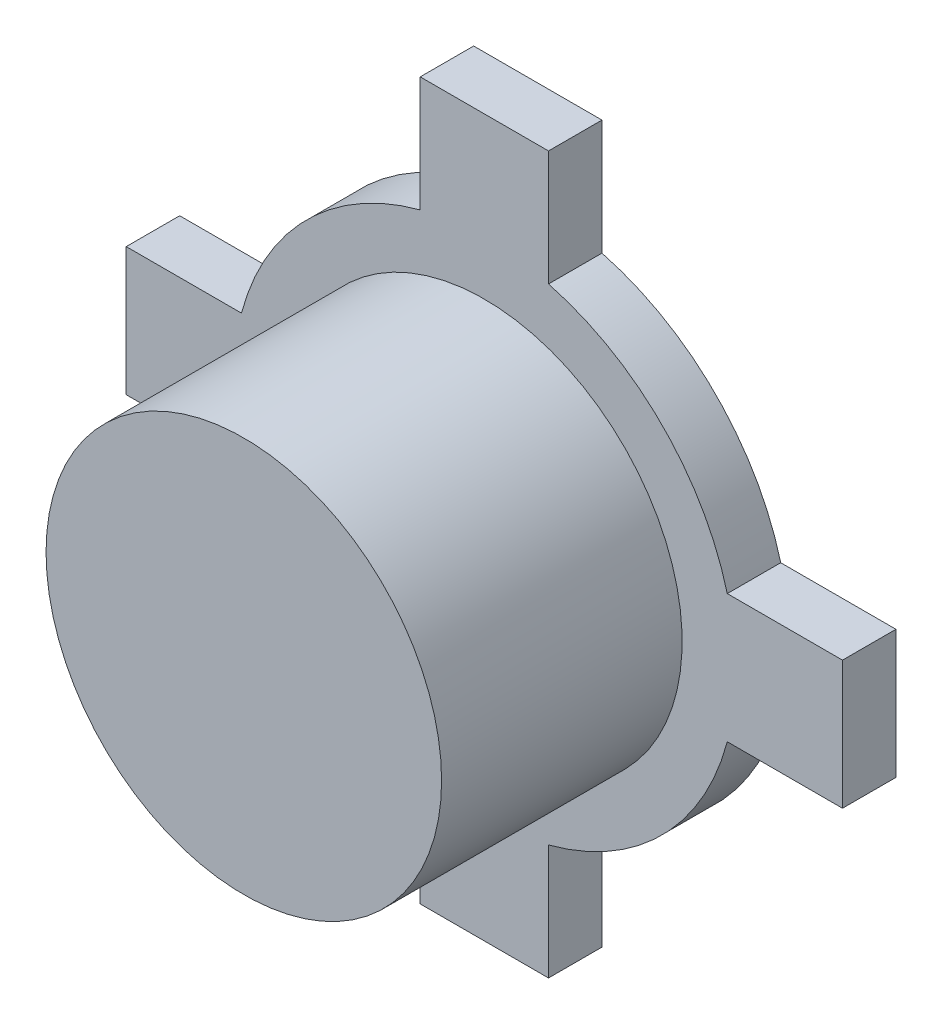
ISO-10303-21;
HEADER;
FILE_DESCRIPTION(('STEP AP214'),'2;1');
FILE_NAME('part.step','',(''),(''),'','','');
FILE_SCHEMA(('AUTOMOTIVE_DESIGN { 1 0 10303 214 1 1 1 1 }'));
ENDSEC;
DATA;
#1=APPLICATION_CONTEXT('core data for automotive mechanical design processes');
#2=APPLICATION_PROTOCOL_DEFINITION('international standard','automotive_design',2000,#1);
#3=PRODUCT_CONTEXT('',#1,'mechanical');
#4=PRODUCT('Part','Part','',(#3));
#5=PRODUCT_RELATED_PRODUCT_CATEGORY('part','',(#4));
#6=PRODUCT_DEFINITION_FORMATION('','',#4);
#7=PRODUCT_DEFINITION_CONTEXT('part definition',#1,'design');
#8=PRODUCT_DEFINITION('design','',#6,#7);
#9=PRODUCT_DEFINITION_SHAPE('','',#8);
#10=(LENGTH_UNIT() NAMED_UNIT(*) SI_UNIT(.MILLI.,.METRE.));
#11=(NAMED_UNIT(*) PLANE_ANGLE_UNIT() SI_UNIT($,.RADIAN.));
#12=(NAMED_UNIT(*) SI_UNIT($,.STERADIAN.) SOLID_ANGLE_UNIT());
#13=UNCERTAINTY_MEASURE_WITH_UNIT(LENGTH_MEASURE(1.E-05),#10,'distance_accuracy_value','');
#14=(GEOMETRIC_REPRESENTATION_CONTEXT(3) GLOBAL_UNCERTAINTY_ASSIGNED_CONTEXT((#13)) GLOBAL_UNIT_ASSIGNED_CONTEXT((#10,
#11,#12)) REPRESENTATION_CONTEXT('',''));
#15=CARTESIAN_POINT('',(0.,0.,0.));
#16=DIRECTION('',(0.,0.,1.));
#17=DIRECTION('',(1.,0.,0.));
#18=AXIS2_PLACEMENT_3D('',#15,#16,#17);
#19=CARTESIAN_POINT('',(0.,0.,4.5));
#20=DIRECTION('',(0.,0.,-1.));
#21=DIRECTION('',(-1.,0.,0.));
#22=AXIS2_PLACEMENT_3D('',#19,#20,#21);
#23=CYLINDRICAL_SURFACE('',#22,3.70000000000001);
#24=CARTESIAN_POINT('',(0.,0.,4.5));
#25=DIRECTION('',(0.,0.,1.));
#26=DIRECTION('',(1.,0.,0.));
#27=AXIS2_PLACEMENT_3D('',#24,#25,#26);
#28=CIRCLE('',#27,3.70000000000001);
#29=CARTESIAN_POINT('',(3.70000000000001,0.,4.5));
#30=VERTEX_POINT('',#29);
#31=EDGE_CURVE('E11',#30,#30,#28,.T.);
#32=ORIENTED_EDGE('',*,*,#31,.F.);
#33=EDGE_LOOP('',(#32));
#34=FACE_BOUND('',#33,.T.);
#35=CARTESIAN_POINT('',(0.,0.,0.));
#36=DIRECTION('',(0.,0.,-1.));
#37=DIRECTION('',(-1.,0.,0.));
#38=AXIS2_PLACEMENT_3D('',#35,#36,#37);
#39=CIRCLE('',#38,3.70000000000001);
#40=CARTESIAN_POINT('',(-3.70000000000001,0.,0.));
#41=VERTEX_POINT('',#40);
#42=EDGE_CURVE('E43',#41,#41,#39,.T.);
#43=ORIENTED_EDGE('',*,*,#42,.F.);
#44=EDGE_LOOP('',(#43));
#45=FACE_BOUND('',#44,.T.);
#46=ADVANCED_FACE('F35',(#34,#45),#23,.T.);
#47=CARTESIAN_POINT('',(0.,0.,4.5));
#48=DIRECTION('',(0.,0.,1.));
#49=DIRECTION('',(1.,0.,0.));
#50=AXIS2_PLACEMENT_3D('',#47,#48,#49);
#51=PLANE('',#50);
#52=ORIENTED_EDGE('',*,*,#31,.T.);
#53=EDGE_LOOP('',(#52));
#54=FACE_BOUND('',#53,.T.);
#55=ADVANCED_FACE('F255',(#54),#51,.T.);
#56=CARTESIAN_POINT('',(-1.2,6.7,-1.));
#57=DIRECTION('',(0.,-1.,0.));
#58=DIRECTION('',(0.,0.,-1.));
#59=AXIS2_PLACEMENT_3D('',#56,#57,#58);
#60=PLANE('',#59);
#61=DIRECTION('',(1.,0.,0.));
#62=VECTOR('',#61,1.);
#63=CARTESIAN_POINT('',(-1.2,6.7,0.));
#64=LINE('',#63,#62);
#65=CARTESIAN_POINT('',(-1.2,6.7,0.));
#66=VERTEX_POINT('',#65);
#67=CARTESIAN_POINT('',(1.2,6.7,0.));
#68=VERTEX_POINT('',#67);
#69=EDGE_CURVE('E180',#66,#68,#64,.T.);
#70=ORIENTED_EDGE('',*,*,#69,.T.);
#71=DIRECTION('',(0.,0.,1.));
#72=VECTOR('',#71,1.);
#73=CARTESIAN_POINT('',(1.2,6.7,-1.));
#74=LINE('',#73,#72);
#75=CARTESIAN_POINT('',(1.2,6.7,-1.));
#76=VERTEX_POINT('',#75);
#77=EDGE_CURVE('E247',#76,#68,#74,.T.);
#78=ORIENTED_EDGE('',*,*,#77,.F.);
#79=DIRECTION('',(1.,0.,0.));
#80=VECTOR('',#79,1.);
#81=CARTESIAN_POINT('',(-1.2,6.7,-1.));
#82=LINE('',#81,#80);
#83=CARTESIAN_POINT('',(-1.2,6.7,-1.));
#84=VERTEX_POINT('',#83);
#85=EDGE_CURVE('E210',#84,#76,#82,.T.);
#86=ORIENTED_EDGE('',*,*,#85,.F.);
#87=DIRECTION('',(0.,0.,1.));
#88=VECTOR('',#87,1.);
#89=CARTESIAN_POINT('',(-1.2,6.7,-1.));
#90=LINE('',#89,#88);
#91=EDGE_CURVE('E176',#84,#66,#90,.T.);
#92=ORIENTED_EDGE('',*,*,#91,.T.);
#93=EDGE_LOOP('',(#70,#78,#86,#92));
#94=FACE_BOUND('',#93,.T.);
#95=ADVANCED_FACE('F260',(#94),#60,.F.);
#96=CARTESIAN_POINT('',(1.2,6.7,-1.));
#97=DIRECTION('',(-1.,0.,0.));
#98=DIRECTION('',(0.,-1.,0.));
#99=AXIS2_PLACEMENT_3D('',#96,#97,#98);
#100=PLANE('',#99);
#101=DIRECTION('',(0.,-1.,0.));
#102=VECTOR('',#101,1.);
#103=CARTESIAN_POINT('',(1.2,6.7,0.));
#104=LINE('',#103,#102);
#105=CARTESIAN_POINT('',(1.2,4.54422710700072,0.));
#106=VERTEX_POINT('',#105);
#107=EDGE_CURVE('E183',#68,#106,#104,.T.);
#108=ORIENTED_EDGE('',*,*,#107,.T.);
#109=DIRECTION('',(0.,0.,1.));
#110=VECTOR('',#109,1.);
#111=CARTESIAN_POINT('',(1.2,4.54422710700072,-1.));
#112=LINE('',#111,#110);
#113=CARTESIAN_POINT('',(1.2,4.54422710700072,-1.));
#114=VERTEX_POINT('',#113);
#115=EDGE_CURVE('E244',#114,#106,#112,.T.);
#116=ORIENTED_EDGE('',*,*,#115,.F.);
#117=DIRECTION('',(0.,-1.,0.));
#118=VECTOR('',#117,1.);
#119=CARTESIAN_POINT('',(1.2,6.7,-1.));
#120=LINE('',#119,#118);
#121=EDGE_CURVE('E119',#76,#114,#120,.T.);
#122=ORIENTED_EDGE('',*,*,#121,.F.);
#123=ORIENTED_EDGE('',*,*,#77,.T.);
#124=EDGE_LOOP('',(#108,#116,#122,#123));
#125=FACE_BOUND('',#124,.T.);
#126=ADVANCED_FACE('F266',(#125),#100,.F.);
#127=CARTESIAN_POINT('',(0.,0.,-1.));
#128=DIRECTION('',(0.,0.,1.));
#129=DIRECTION('',(1.,0.,0.));
#130=AXIS2_PLACEMENT_3D('',#127,#128,#129);
#131=CYLINDRICAL_SURFACE('',#130,4.70000000000001);
#132=CARTESIAN_POINT('',(0.,0.,0.));
#133=DIRECTION('',(0.,0.,-1.));
#134=DIRECTION('',(-1.,0.,0.));
#135=AXIS2_PLACEMENT_3D('',#132,#133,#134);
#136=CIRCLE('',#135,4.70000000000001);
#137=CARTESIAN_POINT('',(4.54422710700072,1.2,0.));
#138=VERTEX_POINT('',#137);
#139=EDGE_CURVE('E185',#106,#138,#136,.T.);
#140=ORIENTED_EDGE('',*,*,#139,.T.);
#141=DIRECTION('',(0.,0.,1.));
#142=VECTOR('',#141,1.);
#143=CARTESIAN_POINT('',(4.54422710700072,1.2,-1.));
#144=LINE('',#143,#142);
#145=CARTESIAN_POINT('',(4.54422710700072,1.2,-1.));
#146=VERTEX_POINT('',#145);
#147=EDGE_CURVE('E241',#146,#138,#144,.T.);
#148=ORIENTED_EDGE('',*,*,#147,.F.);
#149=CARTESIAN_POINT('',(0.,0.,-1.));
#150=DIRECTION('',(0.,0.,-1.));
#151=DIRECTION('',(-1.,0.,0.));
#152=AXIS2_PLACEMENT_3D('',#149,#150,#151);
#153=CIRCLE('',#152,4.70000000000001);
#154=EDGE_CURVE('E450',#114,#146,#153,.T.);
#155=ORIENTED_EDGE('',*,*,#154,.F.);
#156=ORIENTED_EDGE('',*,*,#115,.T.);
#157=EDGE_LOOP('',(#140,#148,#155,#156));
#158=FACE_BOUND('',#157,.T.);
#159=ADVANCED_FACE('F272',(#158),#131,.T.);
#160=CARTESIAN_POINT('',(4.54422710700072,1.2,-1.));
#161=DIRECTION('',(0.,-1.,0.));
#162=DIRECTION('',(0.,0.,-1.));
#163=AXIS2_PLACEMENT_3D('',#160,#161,#162);
#164=PLANE('',#163);
#165=DIRECTION('',(1.,0.,0.));
#166=VECTOR('',#165,1.);
#167=CARTESIAN_POINT('',(4.54422710700072,1.2,0.));
#168=LINE('',#167,#166);
#169=CARTESIAN_POINT('',(6.7,1.2,0.));
#170=VERTEX_POINT('',#169);
#171=EDGE_CURVE('E187',#138,#170,#168,.T.);
#172=ORIENTED_EDGE('',*,*,#171,.T.);
#173=DIRECTION('',(0.,0.,1.));
#174=VECTOR('',#173,1.);
#175=CARTESIAN_POINT('',(6.7,1.2,-1.));
#176=LINE('',#175,#174);
#177=CARTESIAN_POINT('',(6.7,1.2,-1.));
#178=VERTEX_POINT('',#177);
#179=EDGE_CURVE('E238',#178,#170,#176,.T.);
#180=ORIENTED_EDGE('',*,*,#179,.F.);
#181=DIRECTION('',(1.,0.,0.));
#182=VECTOR('',#181,1.);
#183=CARTESIAN_POINT('',(4.54422710700072,1.2,-1.));
#184=LINE('',#183,#182);
#185=EDGE_CURVE('E454',#146,#178,#184,.T.);
#186=ORIENTED_EDGE('',*,*,#185,.F.);
#187=ORIENTED_EDGE('',*,*,#147,.T.);
#188=EDGE_LOOP('',(#172,#180,#186,#187));
#189=FACE_BOUND('',#188,.T.);
#190=ADVANCED_FACE('F275',(#189),#164,.F.);
#191=CARTESIAN_POINT('',(6.7,1.2,-1.));
#192=DIRECTION('',(-1.,0.,0.));
#193=DIRECTION('',(0.,-1.,0.));
#194=AXIS2_PLACEMENT_3D('',#191,#192,#193);
#195=PLANE('',#194);
#196=DIRECTION('',(0.,-1.,0.));
#197=VECTOR('',#196,1.);
#198=CARTESIAN_POINT('',(6.7,1.2,0.));
#199=LINE('',#198,#197);
#200=CARTESIAN_POINT('',(6.7,-1.2,0.));
#201=VERTEX_POINT('',#200);
#202=EDGE_CURVE('E189',#170,#201,#199,.T.);
#203=ORIENTED_EDGE('',*,*,#202,.T.);
#204=DIRECTION('',(0.,0.,1.));
#205=VECTOR('',#204,1.);
#206=CARTESIAN_POINT('',(6.7,-1.2,-1.));
#207=LINE('',#206,#205);
#208=CARTESIAN_POINT('',(6.7,-1.2,-1.));
#209=VERTEX_POINT('',#208);
#210=EDGE_CURVE('E235',#209,#201,#207,.T.);
#211=ORIENTED_EDGE('',*,*,#210,.F.);
#212=DIRECTION('',(0.,-1.,0.));
#213=VECTOR('',#212,1.);
#214=CARTESIAN_POINT('',(6.7,1.2,-1.));
#215=LINE('',#214,#213);
#216=EDGE_CURVE('E456',#178,#209,#215,.T.);
#217=ORIENTED_EDGE('',*,*,#216,.F.);
#218=ORIENTED_EDGE('',*,*,#179,.T.);
#219=EDGE_LOOP('',(#203,#211,#217,#218));
#220=FACE_BOUND('',#219,.T.);
#221=ADVANCED_FACE('F279',(#220),#195,.F.);
#222=CARTESIAN_POINT('',(6.7,-1.2,-1.));
#223=DIRECTION('',(0.,1.,0.));
#224=DIRECTION('',(-1.,0.,0.));
#225=AXIS2_PLACEMENT_3D('',#222,#223,#224);
#226=PLANE('',#225);
#227=DIRECTION('',(-1.,0.,0.));
#228=VECTOR('',#227,1.);
#229=CARTESIAN_POINT('',(6.7,-1.2,0.));
#230=LINE('',#229,#228);
#231=CARTESIAN_POINT('',(4.54422710700072,-1.19999999999999,0.));
#232=VERTEX_POINT('',#231);
#233=EDGE_CURVE('E191',#201,#232,#230,.T.);
#234=ORIENTED_EDGE('',*,*,#233,.T.);
#235=DIRECTION('',(0.,0.,1.));
#236=VECTOR('',#235,1.);
#237=CARTESIAN_POINT('',(4.54422710700072,-1.19999999999999,-1.));
#238=LINE('',#237,#236);
#239=CARTESIAN_POINT('',(4.54422710700072,-1.19999999999999,-1.));
#240=VERTEX_POINT('',#239);
#241=EDGE_CURVE('E232',#240,#232,#238,.T.);
#242=ORIENTED_EDGE('',*,*,#241,.F.);
#243=DIRECTION('',(-1.,0.,0.));
#244=VECTOR('',#243,1.);
#245=CARTESIAN_POINT('',(6.7,-1.2,-1.));
#246=LINE('',#245,#244);
#247=EDGE_CURVE('E458',#209,#240,#246,.T.);
#248=ORIENTED_EDGE('',*,*,#247,.F.);
#249=ORIENTED_EDGE('',*,*,#210,.T.);
#250=EDGE_LOOP('',(#234,#242,#248,#249));
#251=FACE_BOUND('',#250,.T.);
#252=ADVANCED_FACE('F283',(#251),#226,.F.);
#253=CARTESIAN_POINT('',(0.,0.,-1.));
#254=DIRECTION('',(0.,0.,1.));
#255=DIRECTION('',(1.,0.,0.));
#256=AXIS2_PLACEMENT_3D('',#253,#254,#255);
#257=CYLINDRICAL_SURFACE('',#256,4.70000000000001);
#258=CARTESIAN_POINT('',(0.,0.,0.));
#259=DIRECTION('',(0.,0.,-1.));
#260=DIRECTION('',(-1.,0.,0.));
#261=AXIS2_PLACEMENT_3D('',#258,#259,#260);
#262=CIRCLE('',#261,4.70000000000001);
#263=CARTESIAN_POINT('',(1.2,-4.54422710700071,0.));
#264=VERTEX_POINT('',#263);
#265=EDGE_CURVE('E193',#232,#264,#262,.T.);
#266=ORIENTED_EDGE('',*,*,#265,.T.);
#267=DIRECTION('',(0.,0.,1.));
#268=VECTOR('',#267,1.);
#269=CARTESIAN_POINT('',(1.2,-4.54422710700071,-1.));
#270=LINE('',#269,#268);
#271=CARTESIAN_POINT('',(1.2,-4.54422710700071,-1.));
#272=VERTEX_POINT('',#271);
#273=EDGE_CURVE('E229',#272,#264,#270,.T.);
#274=ORIENTED_EDGE('',*,*,#273,.F.);
#275=CARTESIAN_POINT('',(0.,0.,-1.));
#276=DIRECTION('',(0.,0.,-1.));
#277=DIRECTION('',(-1.,0.,0.));
#278=AXIS2_PLACEMENT_3D('',#275,#276,#277);
#279=CIRCLE('',#278,4.70000000000001);
#280=EDGE_CURVE('E460',#240,#272,#279,.T.);
#281=ORIENTED_EDGE('',*,*,#280,.F.);
#282=ORIENTED_EDGE('',*,*,#241,.T.);
#283=EDGE_LOOP('',(#266,#274,#281,#282));
#284=FACE_BOUND('',#283,.T.);
#285=ADVANCED_FACE('F287',(#284),#257,.T.);
#286=CARTESIAN_POINT('',(1.2,-4.54422710700072,-1.));
#287=DIRECTION('',(-1.,0.,0.));
#288=DIRECTION('',(0.,-1.,0.));
#289=AXIS2_PLACEMENT_3D('',#286,#287,#288);
#290=PLANE('',#289);
#291=DIRECTION('',(0.,-1.,0.));
#292=VECTOR('',#291,1.);
#293=CARTESIAN_POINT('',(1.2,-4.54422710700072,0.));
#294=LINE('',#293,#292);
#295=CARTESIAN_POINT('',(1.2,-6.7,0.));
#296=VERTEX_POINT('',#295);
#297=EDGE_CURVE('E195',#264,#296,#294,.T.);
#298=ORIENTED_EDGE('',*,*,#297,.T.);
#299=DIRECTION('',(0.,0.,1.));
#300=VECTOR('',#299,1.);
#301=CARTESIAN_POINT('',(1.2,-6.7,-1.));
#302=LINE('',#301,#300);
#303=CARTESIAN_POINT('',(1.2,-6.7,-1.));
#304=VERTEX_POINT('',#303);
#305=EDGE_CURVE('E226',#304,#296,#302,.T.);
#306=ORIENTED_EDGE('',*,*,#305,.F.);
#307=DIRECTION('',(0.,-1.,0.));
#308=VECTOR('',#307,1.);
#309=CARTESIAN_POINT('',(1.2,-4.54422710700072,-1.));
#310=LINE('',#309,#308);
#311=EDGE_CURVE('E462',#272,#304,#310,.T.);
#312=ORIENTED_EDGE('',*,*,#311,.F.);
#313=ORIENTED_EDGE('',*,*,#273,.T.);
#314=EDGE_LOOP('',(#298,#306,#312,#313));
#315=FACE_BOUND('',#314,.T.);
#316=ADVANCED_FACE('F291',(#315),#290,.F.);
#317=CARTESIAN_POINT('',(1.2,-6.7,-1.));
#318=DIRECTION('',(0.,1.,0.));
#319=DIRECTION('',(0.,0.,1.));
#320=AXIS2_PLACEMENT_3D('',#317,#318,#319);
#321=PLANE('',#320);
#322=DIRECTION('',(-1.,0.,0.));
#323=VECTOR('',#322,1.);
#324=CARTESIAN_POINT('',(1.2,-6.7,0.));
#325=LINE('',#324,#323);
#326=CARTESIAN_POINT('',(-1.2,-6.7,0.));
#327=VERTEX_POINT('',#326);
#328=EDGE_CURVE('E197',#296,#327,#325,.T.);
#329=ORIENTED_EDGE('',*,*,#328,.T.);
#330=DIRECTION('',(0.,0.,1.));
#331=VECTOR('',#330,1.);
#332=CARTESIAN_POINT('',(-1.2,-6.7,-1.));
#333=LINE('',#332,#331);
#334=CARTESIAN_POINT('',(-1.2,-6.7,-1.));
#335=VERTEX_POINT('',#334);
#336=EDGE_CURVE('E223',#335,#327,#333,.T.);
#337=ORIENTED_EDGE('',*,*,#336,.F.);
#338=DIRECTION('',(-1.,0.,0.));
#339=VECTOR('',#338,1.);
#340=CARTESIAN_POINT('',(1.2,-6.7,-1.));
#341=LINE('',#340,#339);
#342=EDGE_CURVE('E464',#304,#335,#341,.T.);
#343=ORIENTED_EDGE('',*,*,#342,.F.);
#344=ORIENTED_EDGE('',*,*,#305,.T.);
#345=EDGE_LOOP('',(#329,#337,#343,#344));
#346=FACE_BOUND('',#345,.T.);
#347=ADVANCED_FACE('F295',(#346),#321,.F.);
#348=CARTESIAN_POINT('',(-1.2,-6.7,-1.));
#349=DIRECTION('',(1.,0.,0.));
#350=DIRECTION('',(0.,1.,0.));
#351=AXIS2_PLACEMENT_3D('',#348,#349,#350);
#352=PLANE('',#351);
#353=DIRECTION('',(0.,1.,0.));
#354=VECTOR('',#353,1.);
#355=CARTESIAN_POINT('',(-1.2,-6.7,0.));
#356=LINE('',#355,#354);
#357=CARTESIAN_POINT('',(-1.2,-4.54422710700072,0.));
#358=VERTEX_POINT('',#357);
#359=EDGE_CURVE('E199',#327,#358,#356,.T.);
#360=ORIENTED_EDGE('',*,*,#359,.T.);
#361=DIRECTION('',(0.,0.,1.));
#362=VECTOR('',#361,1.);
#363=CARTESIAN_POINT('',(-1.2,-4.54422710700072,-1.));
#364=LINE('',#363,#362);
#365=CARTESIAN_POINT('',(-1.2,-4.54422710700072,-1.));
#366=VERTEX_POINT('',#365);
#367=EDGE_CURVE('E220',#366,#358,#364,.T.);
#368=ORIENTED_EDGE('',*,*,#367,.F.);
#369=DIRECTION('',(0.,1.,0.));
#370=VECTOR('',#369,1.);
#371=CARTESIAN_POINT('',(-1.2,-6.7,-1.));
#372=LINE('',#371,#370);
#373=EDGE_CURVE('E466',#335,#366,#372,.T.);
#374=ORIENTED_EDGE('',*,*,#373,.F.);
#375=ORIENTED_EDGE('',*,*,#336,.T.);
#376=EDGE_LOOP('',(#360,#368,#374,#375));
#377=FACE_BOUND('',#376,.T.);
#378=ADVANCED_FACE('F299',(#377),#352,.F.);
#379=CARTESIAN_POINT('',(0.,0.,-1.));
#380=DIRECTION('',(0.,0.,1.));
#381=DIRECTION('',(1.,0.,0.));
#382=AXIS2_PLACEMENT_3D('',#379,#380,#381);
#383=CYLINDRICAL_SURFACE('',#382,4.70000000000001);
#384=CARTESIAN_POINT('',(0.,0.,0.));
#385=DIRECTION('',(0.,0.,-1.));
#386=DIRECTION('',(-1.,0.,0.));
#387=AXIS2_PLACEMENT_3D('',#384,#385,#386);
#388=CIRCLE('',#387,4.70000000000001);
#389=CARTESIAN_POINT('',(-4.54422710700071,-1.2,0.));
#390=VERTEX_POINT('',#389);
#391=EDGE_CURVE('E201',#358,#390,#388,.T.);
#392=ORIENTED_EDGE('',*,*,#391,.T.);
#393=DIRECTION('',(0.,0.,1.));
#394=VECTOR('',#393,1.);
#395=CARTESIAN_POINT('',(-4.54422710700071,-1.2,-1.));
#396=LINE('',#395,#394);
#397=CARTESIAN_POINT('',(-4.54422710700071,-1.2,-1.));
#398=VERTEX_POINT('',#397);
#399=EDGE_CURVE('E217',#398,#390,#396,.T.);
#400=ORIENTED_EDGE('',*,*,#399,.F.);
#401=CARTESIAN_POINT('',(0.,0.,-1.));
#402=DIRECTION('',(0.,0.,-1.));
#403=DIRECTION('',(-1.,0.,0.));
#404=AXIS2_PLACEMENT_3D('',#401,#402,#403);
#405=CIRCLE('',#404,4.70000000000001);
#406=EDGE_CURVE('E468',#366,#398,#405,.T.);
#407=ORIENTED_EDGE('',*,*,#406,.F.);
#408=ORIENTED_EDGE('',*,*,#367,.T.);
#409=EDGE_LOOP('',(#392,#400,#407,#408));
#410=FACE_BOUND('',#409,.T.);
#411=ADVANCED_FACE('F303',(#410),#383,.T.);
#412=CARTESIAN_POINT('',(-4.54422710700072,-1.2,-1.));
#413=DIRECTION('',(0.,1.,0.));
#414=DIRECTION('',(0.,0.,1.));
#415=AXIS2_PLACEMENT_3D('',#412,#413,#414);
#416=PLANE('',#415);
#417=DIRECTION('',(-1.,0.,0.));
#418=VECTOR('',#417,1.);
#419=CARTESIAN_POINT('',(-4.54422710700072,-1.2,0.));
#420=LINE('',#419,#418);
#421=CARTESIAN_POINT('',(-6.7,-1.2,0.));
#422=VERTEX_POINT('',#421);
#423=EDGE_CURVE('E203',#390,#422,#420,.T.);
#424=ORIENTED_EDGE('',*,*,#423,.T.);
#425=DIRECTION('',(0.,0.,1.));
#426=VECTOR('',#425,1.);
#427=CARTESIAN_POINT('',(-6.7,-1.2,-1.));
#428=LINE('',#427,#426);
#429=CARTESIAN_POINT('',(-6.7,-1.2,-1.));
#430=VERTEX_POINT('',#429);
#431=EDGE_CURVE('E214',#430,#422,#428,.T.);
#432=ORIENTED_EDGE('',*,*,#431,.F.);
#433=DIRECTION('',(-1.,0.,0.));
#434=VECTOR('',#433,1.);
#435=CARTESIAN_POINT('',(-4.54422710700072,-1.2,-1.));
#436=LINE('',#435,#434);
#437=EDGE_CURVE('E470',#398,#430,#436,.T.);
#438=ORIENTED_EDGE('',*,*,#437,.F.);
#439=ORIENTED_EDGE('',*,*,#399,.T.);
#440=EDGE_LOOP('',(#424,#432,#438,#439));
#441=FACE_BOUND('',#440,.T.);
#442=ADVANCED_FACE('F307',(#441),#416,.F.);
#443=CARTESIAN_POINT('',(-6.7,-1.2,-1.));
#444=DIRECTION('',(1.,0.,0.));
#445=DIRECTION('',(0.,0.,-1.));
#446=AXIS2_PLACEMENT_3D('',#443,#444,#445);
#447=PLANE('',#446);
#448=DIRECTION('',(0.,1.,0.));
#449=VECTOR('',#448,1.);
#450=CARTESIAN_POINT('',(-6.7,-1.2,0.));
#451=LINE('',#450,#449);
#452=CARTESIAN_POINT('',(-6.7,1.2,0.));
#453=VERTEX_POINT('',#452);
#454=EDGE_CURVE('E205',#422,#453,#451,.T.);
#455=ORIENTED_EDGE('',*,*,#454,.T.);
#456=DIRECTION('',(0.,0.,1.));
#457=VECTOR('',#456,1.);
#458=CARTESIAN_POINT('',(-6.7,1.2,-1.));
#459=LINE('',#458,#457);
#460=CARTESIAN_POINT('',(-6.7,1.2,-1.));
#461=VERTEX_POINT('',#460);
#462=EDGE_CURVE('E171',#461,#453,#459,.T.);
#463=ORIENTED_EDGE('',*,*,#462,.F.);
#464=DIRECTION('',(0.,1.,0.));
#465=VECTOR('',#464,1.);
#466=CARTESIAN_POINT('',(-6.7,-1.2,-1.));
#467=LINE('',#466,#465);
#468=EDGE_CURVE('E162',#430,#461,#467,.T.);
#469=ORIENTED_EDGE('',*,*,#468,.F.);
#470=ORIENTED_EDGE('',*,*,#431,.T.);
#471=EDGE_LOOP('',(#455,#463,#469,#470));
#472=FACE_BOUND('',#471,.T.);
#473=ADVANCED_FACE('F311',(#472),#447,.F.);
#474=CARTESIAN_POINT('',(-6.7,1.2,-1.));
#475=DIRECTION('',(0.,-1.,0.));
#476=DIRECTION('',(0.,0.,-1.));
#477=AXIS2_PLACEMENT_3D('',#474,#475,#476);
#478=PLANE('',#477);
#479=DIRECTION('',(1.,0.,0.));
#480=VECTOR('',#479,1.);
#481=CARTESIAN_POINT('',(-6.7,1.2,0.));
#482=LINE('',#481,#480);
#483=CARTESIAN_POINT('',(-4.54422710700072,1.2,0.));
#484=VERTEX_POINT('',#483);
#485=EDGE_CURVE('E170',#453,#484,#482,.T.);
#486=ORIENTED_EDGE('',*,*,#485,.T.);
#487=DIRECTION('',(0.,0.,1.));
#488=VECTOR('',#487,1.);
#489=CARTESIAN_POINT('',(-4.54422710700072,1.2,-1.));
#490=LINE('',#489,#488);
#491=CARTESIAN_POINT('',(-4.54422710700072,1.2,-1.));
#492=VERTEX_POINT('',#491);
#493=EDGE_CURVE('E167',#492,#484,#490,.T.);
#494=ORIENTED_EDGE('',*,*,#493,.F.);
#495=DIRECTION('',(1.,0.,0.));
#496=VECTOR('',#495,1.);
#497=CARTESIAN_POINT('',(-6.7,1.2,-1.));
#498=LINE('',#497,#496);
#499=EDGE_CURVE('E156',#461,#492,#498,.T.);
#500=ORIENTED_EDGE('',*,*,#499,.F.);
#501=ORIENTED_EDGE('',*,*,#462,.T.);
#502=EDGE_LOOP('',(#486,#494,#500,#501));
#503=FACE_BOUND('',#502,.T.);
#504=ADVANCED_FACE('F168',(#503),#478,.F.);
#505=CARTESIAN_POINT('',(0.,0.,-1.));
#506=DIRECTION('',(0.,0.,1.));
#507=DIRECTION('',(1.,0.,0.));
#508=AXIS2_PLACEMENT_3D('',#505,#506,#507);
#509=CYLINDRICAL_SURFACE('',#508,4.70000000000001);
#510=CARTESIAN_POINT('',(0.,0.,0.));
#511=DIRECTION('',(0.,0.,-1.));
#512=DIRECTION('',(-1.,0.,0.));
#513=AXIS2_PLACEMENT_3D('',#510,#511,#512);
#514=CIRCLE('',#513,4.70000000000001);
#515=CARTESIAN_POINT('',(-1.2,4.54422710700072,0.));
#516=VERTEX_POINT('',#515);
#517=EDGE_CURVE('E104',#484,#516,#514,.T.);
#518=ORIENTED_EDGE('',*,*,#517,.T.);
#519=DIRECTION('',(0.,0.,1.));
#520=VECTOR('',#519,1.);
#521=CARTESIAN_POINT('',(-1.2,4.54422710700072,-1.));
#522=LINE('',#521,#520);
#523=CARTESIAN_POINT('',(-1.2,4.54422710700072,-1.));
#524=VERTEX_POINT('',#523);
#525=EDGE_CURVE('E172',#524,#516,#522,.T.);
#526=ORIENTED_EDGE('',*,*,#525,.F.);
#527=CARTESIAN_POINT('',(0.,0.,-1.));
#528=DIRECTION('',(0.,0.,-1.));
#529=DIRECTION('',(-1.,0.,0.));
#530=AXIS2_PLACEMENT_3D('',#527,#528,#529);
#531=CIRCLE('',#530,4.70000000000001);
#532=EDGE_CURVE('E160',#492,#524,#531,.T.);
#533=ORIENTED_EDGE('',*,*,#532,.F.);
#534=ORIENTED_EDGE('',*,*,#493,.T.);
#535=EDGE_LOOP('',(#518,#526,#533,#534));
#536=FACE_BOUND('',#535,.T.);
#537=ADVANCED_FACE('F174',(#536),#509,.T.);
#538=CARTESIAN_POINT('',(-1.2,4.54422710700072,-1.));
#539=DIRECTION('',(1.,0.,0.));
#540=DIRECTION('',(0.,1.,0.));
#541=AXIS2_PLACEMENT_3D('',#538,#539,#540);
#542=PLANE('',#541);
#543=DIRECTION('',(0.,1.,0.));
#544=VECTOR('',#543,1.);
#545=CARTESIAN_POINT('',(-1.2,4.54422710700072,0.));
#546=LINE('',#545,#544);
#547=EDGE_CURVE('E110',#516,#66,#546,.T.);
#548=ORIENTED_EDGE('',*,*,#547,.T.);
#549=ORIENTED_EDGE('',*,*,#91,.F.);
#550=DIRECTION('',(0.,1.,0.));
#551=VECTOR('',#550,1.);
#552=CARTESIAN_POINT('',(-1.2,4.54422710700072,-1.));
#553=LINE('',#552,#551);
#554=EDGE_CURVE('E51',#524,#84,#553,.T.);
#555=ORIENTED_EDGE('',*,*,#554,.F.);
#556=ORIENTED_EDGE('',*,*,#525,.T.);
#557=EDGE_LOOP('',(#548,#549,#555,#556));
#558=FACE_BOUND('',#557,.T.);
#559=ADVANCED_FACE('F320',(#558),#542,.F.);
#560=CARTESIAN_POINT('',(0.,0.,-1.));
#561=DIRECTION('',(0.,0.,-1.));
#562=DIRECTION('',(-1.,0.,0.));
#563=AXIS2_PLACEMENT_3D('',#560,#561,#562);
#564=PLANE('',#563);
#565=ORIENTED_EDGE('',*,*,#85,.T.);
#566=ORIENTED_EDGE('',*,*,#121,.T.);
#567=ORIENTED_EDGE('',*,*,#154,.T.);
#568=ORIENTED_EDGE('',*,*,#185,.T.);
#569=ORIENTED_EDGE('',*,*,#216,.T.);
#570=ORIENTED_EDGE('',*,*,#247,.T.);
#571=ORIENTED_EDGE('',*,*,#280,.T.);
#572=ORIENTED_EDGE('',*,*,#311,.T.);
#573=ORIENTED_EDGE('',*,*,#342,.T.);
#574=ORIENTED_EDGE('',*,*,#373,.T.);
#575=ORIENTED_EDGE('',*,*,#406,.T.);
#576=ORIENTED_EDGE('',*,*,#437,.T.);
#577=ORIENTED_EDGE('',*,*,#468,.T.);
#578=ORIENTED_EDGE('',*,*,#499,.T.);
#579=ORIENTED_EDGE('',*,*,#532,.T.);
#580=ORIENTED_EDGE('',*,*,#554,.T.);
#581=EDGE_LOOP('',(#565,#566,#567,#568,#569,#570,#571,#572,#573,#574,#575,#576,#577,#578,#579,#580));
#582=FACE_BOUND('',#581,.T.);
#583=ADVANCED_FACE('F158',(#582),#564,.T.);
#584=CARTESIAN_POINT('',(0.,0.,0.));
#585=DIRECTION('',(0.,0.,-1.));
#586=DIRECTION('',(-1.,0.,0.));
#587=AXIS2_PLACEMENT_3D('',#584,#585,#586);
#588=PLANE('',#587);
#589=ORIENTED_EDGE('',*,*,#42,.T.);
#590=EDGE_LOOP('',(#589));
#591=FACE_BOUND('',#590,.T.);
#592=ORIENTED_EDGE('',*,*,#69,.F.);
#593=ORIENTED_EDGE('',*,*,#547,.F.);
#594=ORIENTED_EDGE('',*,*,#517,.F.);
#595=ORIENTED_EDGE('',*,*,#485,.F.);
#596=ORIENTED_EDGE('',*,*,#454,.F.);
#597=ORIENTED_EDGE('',*,*,#423,.F.);
#598=ORIENTED_EDGE('',*,*,#391,.F.);
#599=ORIENTED_EDGE('',*,*,#359,.F.);
#600=ORIENTED_EDGE('',*,*,#328,.F.);
#601=ORIENTED_EDGE('',*,*,#297,.F.);
#602=ORIENTED_EDGE('',*,*,#265,.F.);
#603=ORIENTED_EDGE('',*,*,#233,.F.);
#604=ORIENTED_EDGE('',*,*,#202,.F.);
#605=ORIENTED_EDGE('',*,*,#171,.F.);
#606=ORIENTED_EDGE('',*,*,#139,.F.);
#607=ORIENTED_EDGE('',*,*,#107,.F.);
#608=EDGE_LOOP('',(#592,#593,#594,#595,#596,#597,#598,#599,#600,#601,#602,#603,#604,#605,#606,#607));
#609=FACE_BOUND('',#608,.T.);
#610=ADVANCED_FACE('F251',(#591,#609),#588,.F.);
#611=CLOSED_SHELL('',(#46,#55,#95,#126,#159,#190,#221,#252,#285,#316,#347,#378,#411,#442,#473,
#504,#537,#559,#583,#610));
#612=MANIFOLD_SOLID_BREP('B2',#611);
#613=ADVANCED_BREP_SHAPE_REPRESENTATION('',(#18,#612),#14);
#614=SHAPE_DEFINITION_REPRESENTATION(#9,#613);
ENDSEC;
END-ISO-10303-21;
